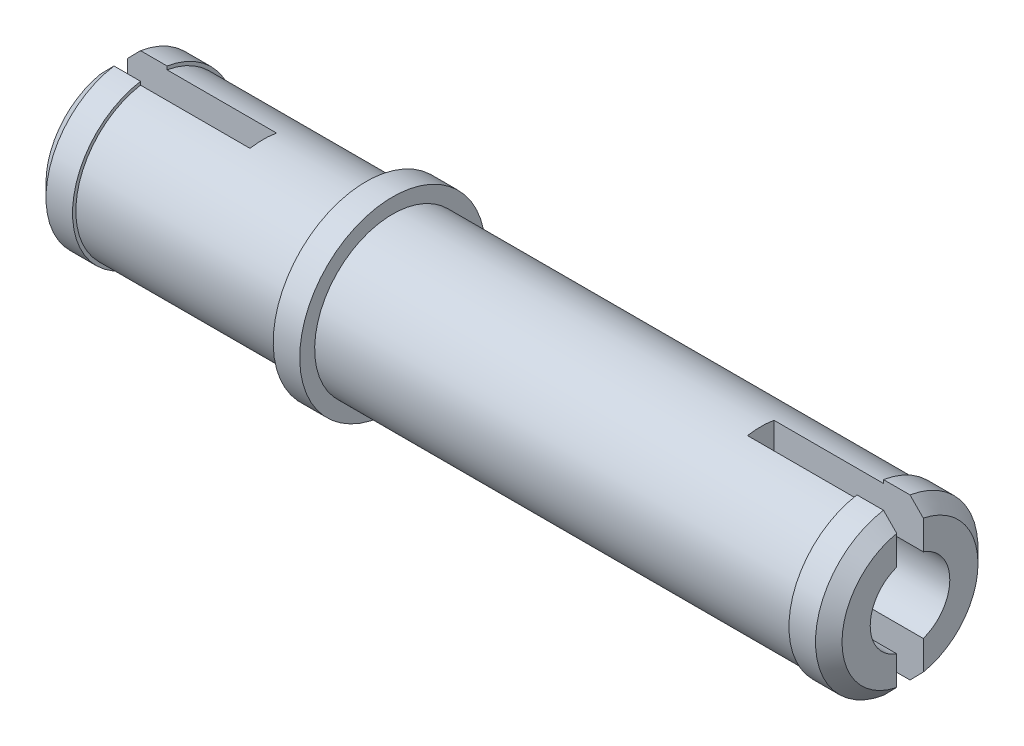
ISO-10303-21;
HEADER;
FILE_DESCRIPTION(('STEP AP214'),'2;1');
FILE_NAME('part.step','',(''),(''),'','','');
FILE_SCHEMA(('AUTOMOTIVE_DESIGN { 1 0 10303 214 1 1 1 1 }'));
ENDSEC;
DATA;
#1=APPLICATION_CONTEXT('core data for automotive mechanical design processes');
#2=APPLICATION_PROTOCOL_DEFINITION('international standard','automotive_design',2000,#1);
#3=PRODUCT_CONTEXT('',#1,'mechanical');
#4=PRODUCT('Part','Part','',(#3));
#5=PRODUCT_RELATED_PRODUCT_CATEGORY('part','',(#4));
#6=PRODUCT_DEFINITION_FORMATION('','',#4);
#7=PRODUCT_DEFINITION_CONTEXT('part definition',#1,'design');
#8=PRODUCT_DEFINITION('design','',#6,#7);
#9=PRODUCT_DEFINITION_SHAPE('','',#8);
#10=(LENGTH_UNIT() NAMED_UNIT(*) SI_UNIT(.MILLI.,.METRE.));
#11=(NAMED_UNIT(*) PLANE_ANGLE_UNIT() SI_UNIT($,.RADIAN.));
#12=(NAMED_UNIT(*) SI_UNIT($,.STERADIAN.) SOLID_ANGLE_UNIT());
#13=UNCERTAINTY_MEASURE_WITH_UNIT(LENGTH_MEASURE(1.E-05),#10,'distance_accuracy_value','');
#14=(GEOMETRIC_REPRESENTATION_CONTEXT(3) GLOBAL_UNCERTAINTY_ASSIGNED_CONTEXT((#13)) GLOBAL_UNIT_ASSIGNED_CONTEXT((#10,
#11,#12)) REPRESENTATION_CONTEXT('',''));
#15=CARTESIAN_POINT('',(0.,0.,0.));
#16=DIRECTION('',(0.,0.,1.));
#17=DIRECTION('',(1.,0.,0.));
#18=AXIS2_PLACEMENT_3D('',#15,#16,#17);
#19=CARTESIAN_POINT('',(-7.5,-2.8,-0.4));
#20=DIRECTION('',(1.,0.,0.));
#21=DIRECTION('',(0.,0.,-1.));
#22=AXIS2_PLACEMENT_3D('',#19,#20,#21);
#23=PLANE('',#22);
#24=DIRECTION('',(0.,1.,0.));
#25=VECTOR('',#24,1.);
#26=CARTESIAN_POINT('',(-7.5,-2.8,-0.4));
#27=LINE('',#26,#25);
#28=CARTESIAN_POINT('',(-7.5,1.13137084989848,-0.4));
#29=VERTEX_POINT('',#28);
#30=CARTESIAN_POINT('',(-7.5,2.31570723538188,-0.4));
#31=VERTEX_POINT('',#30);
#32=EDGE_CURVE('E361',#29,#31,#27,.T.);
#33=ORIENTED_EDGE('',*,*,#32,.F.);
#34=CARTESIAN_POINT('',(-7.5,0.,0.));
#35=DIRECTION('',(1.,0.,0.));
#36=DIRECTION('',(0.,0.,-1.));
#37=AXIS2_PLACEMENT_3D('',#34,#35,#36);
#38=CIRCLE('',#37,1.2);
#39=CARTESIAN_POINT('',(-7.5,1.13137084989848,0.4));
#40=VERTEX_POINT('',#39);
#41=EDGE_CURVE('E231',#29,#40,#38,.T.);
#42=ORIENTED_EDGE('',*,*,#41,.T.);
#43=DIRECTION('',(0.,1.,0.));
#44=VECTOR('',#43,1.);
#45=CARTESIAN_POINT('',(-7.5,-2.8,0.4));
#46=LINE('',#45,#44);
#47=CARTESIAN_POINT('',(-7.5,2.31570723538188,0.4));
#48=VERTEX_POINT('',#47);
#49=EDGE_CURVE('E488',#40,#48,#46,.T.);
#50=ORIENTED_EDGE('',*,*,#49,.T.);
#51=CARTESIAN_POINT('',(-7.5,0.,0.));
#52=DIRECTION('',(1.,0.,0.));
#53=DIRECTION('',(0.,0.,-1.));
#54=AXIS2_PLACEMENT_3D('',#51,#52,#53);
#55=CIRCLE('',#54,2.35);
#56=EDGE_CURVE('E263',#31,#48,#55,.T.);
#57=ORIENTED_EDGE('',*,*,#56,.F.);
#58=EDGE_LOOP('',(#33,#42,#50,#57));
#59=FACE_BOUND('',#58,.T.);
#60=ADVANCED_FACE('F43',(#59),#23,.F.);
#61=CARTESIAN_POINT('',(-14.822757876136,-2.8,0.4));
#62=DIRECTION('',(0.,0.,1.));
#63=DIRECTION('',(1.,0.,0.));
#64=AXIS2_PLACEMENT_3D('',#61,#62,#63);
#65=PLANE('',#64);
#66=DIRECTION('',(0.,-1.,0.));
#67=VECTOR('',#66,1.);
#68=CARTESIAN_POINT('',(-12.,0.,0.4));
#69=LINE('',#68,#67);
#70=CARTESIAN_POINT('',(-12.,-1.13137084989847,0.4));
#71=VERTEX_POINT('',#70);
#72=CARTESIAN_POINT('',(-12.,-2.01059692628831,0.4));
#73=VERTEX_POINT('',#72);
#74=EDGE_CURVE('E254',#71,#73,#69,.T.);
#75=ORIENTED_EDGE('',*,*,#74,.F.);
#76=DIRECTION('',(1.,0.,0.));
#77=VECTOR('',#76,1.);
#78=CARTESIAN_POINT('',(-12.,-1.13137084989847,0.4));
#79=LINE('',#78,#77);
#80=CARTESIAN_POINT('',(-7.5,-1.13137084989847,0.4));
#81=VERTEX_POINT('',#80);
#82=EDGE_CURVE('E235',#71,#81,#79,.T.);
#83=ORIENTED_EDGE('',*,*,#82,.T.);
#84=CARTESIAN_POINT('',(-7.5,-2.31570723538188,0.4));
#85=VERTEX_POINT('',#84);
#86=EDGE_CURVE('E372',#85,#81,#46,.T.);
#87=ORIENTED_EDGE('',*,*,#86,.F.);
#88=DIRECTION('',(-1.,0.,0.));
#89=VECTOR('',#88,1.);
#90=CARTESIAN_POINT('',(-12.,-2.31570723538188,0.4));
#91=LINE('',#90,#89);
#92=CARTESIAN_POINT('',(-10.8,-2.31570723538188,0.4));
#93=VERTEX_POINT('',#92);
#94=EDGE_CURVE('E394',#93,#85,#91,.F.);
#95=ORIENTED_EDGE('',*,*,#94,.F.);
#96=DIRECTION('',(0.,1.,0.));
#97=VECTOR('',#96,1.);
#98=CARTESIAN_POINT('',(-10.8,2.45,0.4));
#99=LINE('',#98,#97);
#100=CARTESIAN_POINT('',(-10.8,-2.41712639305437,0.4));
#101=VERTEX_POINT('',#100);
#102=EDGE_CURVE('E393',#101,#93,#99,.T.);
#103=ORIENTED_EDGE('',*,*,#102,.F.);
#104=DIRECTION('',(-1.,0.,0.));
#105=VECTOR('',#104,1.);
#106=CARTESIAN_POINT('',(-12.,-2.41712639305437,0.4));
#107=LINE('',#106,#105);
#108=CARTESIAN_POINT('',(-11.6,-2.41712639305437,0.4));
#109=VERTEX_POINT('',#108);
#110=EDGE_CURVE('E385',#109,#101,#107,.F.);
#111=ORIENTED_EDGE('',*,*,#110,.F.);
#112=CARTESIAN_POINT('',(-11.6,-2.41712639305437,0.4));
#113=CARTESIAN_POINT('',(-11.6667657648852,-2.34946899482109,0.4));
#114=CARTESIAN_POINT('',(-11.7334819790785,-2.2817628417537,0.4));
#115=CARTESIAN_POINT('',(-11.8668153124213,-2.14625301950762,0.4));
#116=CARTESIAN_POINT('',(-11.9334324315613,-2.07844935031966,0.4));
#117=CARTESIAN_POINT('',(-12.,-2.01059692628831,0.4));
#118=B_SPLINE_CURVE_WITH_KNOTS('',3,(#112,#113,#114,#115,#116,#117),.UNSPECIFIED.,.F.,.F.,(4,2,
4),(0.,0.28516063472249,0.570321296561957),.UNSPECIFIED.);
#119=EDGE_CURVE('E563',#109,#73,#118,.T.);
#120=ORIENTED_EDGE('',*,*,#119,.T.);
#121=EDGE_LOOP('',(#75,#83,#87,#95,#103,#111,#120));
#122=FACE_BOUND('',#121,.T.);
#123=ADVANCED_FACE('F485',(#122),#65,.F.);
#124=CARTESIAN_POINT('',(-14.822757876136,-2.8,-0.4));
#125=DIRECTION('',(0.,0.,-1.));
#126=DIRECTION('',(-1.,0.,0.));
#127=AXIS2_PLACEMENT_3D('',#124,#125,#126);
#128=PLANE('',#127);
#129=DIRECTION('',(0.,1.,0.));
#130=VECTOR('',#129,1.);
#131=CARTESIAN_POINT('',(-12.,0.,-0.4));
#132=LINE('',#131,#130);
#133=CARTESIAN_POINT('',(-12.,1.13137084989848,-0.4));
#134=VERTEX_POINT('',#133);
#135=CARTESIAN_POINT('',(-12.,2.0105969262883,-0.4));
#136=VERTEX_POINT('',#135);
#137=EDGE_CURVE('E241',#134,#136,#132,.T.);
#138=ORIENTED_EDGE('',*,*,#137,.F.);
#139=DIRECTION('',(1.,0.,0.));
#140=VECTOR('',#139,1.);
#141=CARTESIAN_POINT('',(-12.,1.13137084989848,-0.4));
#142=LINE('',#141,#140);
#143=EDGE_CURVE('E228',#134,#29,#142,.T.);
#144=ORIENTED_EDGE('',*,*,#143,.T.);
#145=ORIENTED_EDGE('',*,*,#32,.T.);
#146=DIRECTION('',(-1.,0.,0.));
#147=VECTOR('',#146,1.);
#148=CARTESIAN_POINT('',(-12.,2.31570723538188,-0.4));
#149=LINE('',#148,#147);
#150=CARTESIAN_POINT('',(-10.8,2.31570723538188,-0.4));
#151=VERTEX_POINT('',#150);
#152=EDGE_CURVE('E379',#151,#31,#149,.F.);
#153=ORIENTED_EDGE('',*,*,#152,.F.);
#154=DIRECTION('',(0.,-1.,0.));
#155=VECTOR('',#154,1.);
#156=CARTESIAN_POINT('',(-10.8,2.45,-0.4));
#157=LINE('',#156,#155);
#158=CARTESIAN_POINT('',(-10.8,2.41712639305436,-0.4));
#159=VERTEX_POINT('',#158);
#160=EDGE_CURVE('E378',#159,#151,#157,.T.);
#161=ORIENTED_EDGE('',*,*,#160,.F.);
#162=DIRECTION('',(-1.,0.,0.));
#163=VECTOR('',#162,1.);
#164=CARTESIAN_POINT('',(-12.,2.41712639305436,-0.4));
#165=LINE('',#164,#163);
#166=CARTESIAN_POINT('',(-11.6,2.41712639305436,-0.4));
#167=VERTEX_POINT('',#166);
#168=EDGE_CURVE('E369',#167,#159,#165,.F.);
#169=ORIENTED_EDGE('',*,*,#168,.F.);
#170=CARTESIAN_POINT('',(-11.6,2.41712639305436,-0.4));
#171=CARTESIAN_POINT('',(-11.6667657648852,2.34946899482109,-0.4));
#172=CARTESIAN_POINT('',(-11.7334819790785,2.2817628417537,-0.4));
#173=CARTESIAN_POINT('',(-11.8668153124213,2.14625301950761,-0.4));
#174=CARTESIAN_POINT('',(-11.9334324315613,2.07844935031965,-0.4));
#175=CARTESIAN_POINT('',(-12.,2.0105969262883,-0.4));
#176=B_SPLINE_CURVE_WITH_KNOTS('',3,(#170,#171,#172,#173,#174,#175),.UNSPECIFIED.,.F.,.F.,(4,2,
4),(0.,0.285160634722489,0.570321296561957),.UNSPECIFIED.);
#177=EDGE_CURVE('E250',#167,#136,#176,.T.);
#178=ORIENTED_EDGE('',*,*,#177,.T.);
#179=EDGE_LOOP('',(#138,#144,#145,#153,#161,#169,#178));
#180=FACE_BOUND('',#179,.T.);
#181=ADVANCED_FACE('F247',(#180),#128,.F.);
#182=CARTESIAN_POINT('',(7.5,-2.8,-0.400000000000001));
#183=DIRECTION('',(-1.,0.,0.));
#184=DIRECTION('',(0.,0.,1.));
#185=AXIS2_PLACEMENT_3D('',#182,#183,#184);
#186=PLANE('',#185);
#187=DIRECTION('',(0.,1.,0.));
#188=VECTOR('',#187,1.);
#189=CARTESIAN_POINT('',(7.5,-2.8,0.399999999999999));
#190=LINE('',#189,#188);
#191=CARTESIAN_POINT('',(7.5,1.13137084989848,0.399999999999999));
#192=VERTEX_POINT('',#191);
#193=CARTESIAN_POINT('',(7.5,2.31570723538188,0.399999999999999));
#194=VERTEX_POINT('',#193);
#195=EDGE_CURVE('E350',#192,#194,#190,.T.);
#196=ORIENTED_EDGE('',*,*,#195,.F.);
#197=CARTESIAN_POINT('',(7.5,0.,0.));
#198=DIRECTION('',(-1.,0.,0.));
#199=DIRECTION('',(0.,0.,1.));
#200=AXIS2_PLACEMENT_3D('',#197,#198,#199);
#201=CIRCLE('',#200,1.2);
#202=CARTESIAN_POINT('',(7.5,1.13137084989848,-0.400000000000001));
#203=VERTEX_POINT('',#202);
#204=EDGE_CURVE('E68',#192,#203,#201,.T.);
#205=ORIENTED_EDGE('',*,*,#204,.T.);
#206=DIRECTION('',(0.,1.,0.));
#207=VECTOR('',#206,1.);
#208=CARTESIAN_POINT('',(7.5,-2.8,-0.400000000000001));
#209=LINE('',#208,#207);
#210=CARTESIAN_POINT('',(7.5,2.31570723538188,-0.400000000000001));
#211=VERTEX_POINT('',#210);
#212=EDGE_CURVE('E363',#203,#211,#209,.T.);
#213=ORIENTED_EDGE('',*,*,#212,.T.);
#214=CARTESIAN_POINT('',(7.5,0.,0.));
#215=DIRECTION('',(-1.,0.,0.));
#216=DIRECTION('',(0.,0.,1.));
#217=AXIS2_PLACEMENT_3D('',#214,#215,#216);
#218=CIRCLE('',#217,2.35);
#219=EDGE_CURVE('E274',#194,#211,#218,.T.);
#220=ORIENTED_EDGE('',*,*,#219,.F.);
#221=EDGE_LOOP('',(#196,#205,#213,#220));
#222=FACE_BOUND('',#221,.T.);
#223=ADVANCED_FACE('F322',(#222),#186,.F.);
#224=CARTESIAN_POINT('',(14.0570065467415,-2.8,-0.400000000000001));
#225=DIRECTION('',(0.,0.,-1.));
#226=DIRECTION('',(-1.,0.,0.));
#227=AXIS2_PLACEMENT_3D('',#224,#225,#226);
#228=PLANE('',#227);
#229=ORIENTED_EDGE('',*,*,#212,.F.);
#230=DIRECTION('',(1.,0.,0.));
#231=VECTOR('',#230,1.);
#232=CARTESIAN_POINT('',(-12.,1.13137084989848,-0.4));
#233=LINE('',#232,#231);
#234=CARTESIAN_POINT('',(12.,1.13137084989848,-0.4));
#235=VERTEX_POINT('',#234);
#236=EDGE_CURVE('E505',#203,#235,#233,.T.);
#237=ORIENTED_EDGE('',*,*,#236,.T.);
#238=DIRECTION('',(0.,-1.,0.));
#239=VECTOR('',#238,1.);
#240=CARTESIAN_POINT('',(12.,2.45,-0.400000000000001));
#241=LINE('',#240,#239);
#242=CARTESIAN_POINT('',(12.,2.01059692628831,-0.400000000000001));
#243=VERTEX_POINT('',#242);
#244=EDGE_CURVE('E420',#243,#235,#241,.T.);
#245=ORIENTED_EDGE('',*,*,#244,.F.);
#246=CARTESIAN_POINT('',(12.,2.01059692628831,-0.400000000000001));
#247=CARTESIAN_POINT('',(11.9334324315613,2.07844935031966,-0.400000000000001));
#248=CARTESIAN_POINT('',(11.8668153124213,2.14625301950762,-0.400000000000001));
#249=CARTESIAN_POINT('',(11.7334819790785,2.2817628417537,-0.400000000000001));
#250=CARTESIAN_POINT('',(11.6667657648852,2.34946899482109,-0.400000000000001));
#251=CARTESIAN_POINT('',(11.6,2.41712639305436,-0.400000000000001));
#252=B_SPLINE_CURVE_WITH_KNOTS('',3,(#246,#247,#248,#249,#250,#251),.UNSPECIFIED.,.F.,.F.,(4,2,
4),(0.,0.285160661839461,0.570321296561944),.UNSPECIFIED.);
#253=CARTESIAN_POINT('',(11.6,2.41712639305436,-0.4));
#254=VERTEX_POINT('',#253);
#255=EDGE_CURVE('E540',#243,#254,#252,.T.);
#256=ORIENTED_EDGE('',*,*,#255,.T.);
#257=DIRECTION('',(-1.,0.,0.));
#258=VECTOR('',#257,1.);
#259=CARTESIAN_POINT('',(-12.,2.41712639305436,-0.4));
#260=LINE('',#259,#258);
#261=CARTESIAN_POINT('',(10.8,2.41712639305436,-0.400000000000001));
#262=VERTEX_POINT('',#261);
#263=EDGE_CURVE('E415',#262,#254,#260,.F.);
#264=ORIENTED_EDGE('',*,*,#263,.F.);
#265=DIRECTION('',(0.,1.,0.));
#266=VECTOR('',#265,1.);
#267=CARTESIAN_POINT('',(10.8,2.35,-0.400000000000001));
#268=LINE('',#267,#266);
#269=CARTESIAN_POINT('',(10.8,2.31570723538188,-0.4));
#270=VERTEX_POINT('',#269);
#271=EDGE_CURVE('E412',#270,#262,#268,.T.);
#272=ORIENTED_EDGE('',*,*,#271,.F.);
#273=DIRECTION('',(-1.,0.,0.));
#274=VECTOR('',#273,1.);
#275=CARTESIAN_POINT('',(-12.,2.31570723538188,-0.4));
#276=LINE('',#275,#274);
#277=EDGE_CURVE('E280',#211,#270,#276,.F.);
#278=ORIENTED_EDGE('',*,*,#277,.F.);
#279=EDGE_LOOP('',(#229,#237,#245,#256,#264,#272,#278));
#280=FACE_BOUND('',#279,.T.);
#281=ADVANCED_FACE('F584',(#280),#228,.F.);
#282=CARTESIAN_POINT('',(14.0570065467415,-2.8,0.399999999999999));
#283=DIRECTION('',(0.,0.,1.));
#284=DIRECTION('',(1.,0.,0.));
#285=AXIS2_PLACEMENT_3D('',#282,#283,#284);
#286=PLANE('',#285);
#287=CARTESIAN_POINT('',(7.5,-2.31570723538188,0.399999999999999));
#288=VERTEX_POINT('',#287);
#289=CARTESIAN_POINT('',(7.5,-1.13137084989847,0.4));
#290=VERTEX_POINT('',#289);
#291=EDGE_CURVE('E357',#288,#290,#190,.T.);
#292=ORIENTED_EDGE('',*,*,#291,.T.);
#293=DIRECTION('',(1.,0.,0.));
#294=VECTOR('',#293,1.);
#295=CARTESIAN_POINT('',(-12.,-1.13137084989847,0.4));
#296=LINE('',#295,#294);
#297=CARTESIAN_POINT('',(12.,-1.13137084989847,0.399999999999999));
#298=VERTEX_POINT('',#297);
#299=EDGE_CURVE('E11',#290,#298,#296,.T.);
#300=ORIENTED_EDGE('',*,*,#299,.T.);
#301=DIRECTION('',(0.,1.,0.));
#302=VECTOR('',#301,1.);
#303=CARTESIAN_POINT('',(12.,2.45,0.399999999999999));
#304=LINE('',#303,#302);
#305=CARTESIAN_POINT('',(12.,-2.01059692628831,0.399999999999999));
#306=VERTEX_POINT('',#305);
#307=EDGE_CURVE('E407',#306,#298,#304,.T.);
#308=ORIENTED_EDGE('',*,*,#307,.F.);
#309=CARTESIAN_POINT('',(12.,-2.01059692628831,0.399999999999999));
#310=CARTESIAN_POINT('',(11.9334324315613,-2.07844935031966,0.399999999999999));
#311=CARTESIAN_POINT('',(11.8668153124213,-2.14625301950762,0.399999999999999));
#312=CARTESIAN_POINT('',(11.7334819790785,-2.2817628417537,0.399999999999999));
#313=CARTESIAN_POINT('',(11.6667657648852,-2.34946899482109,0.399999999999999));
#314=CARTESIAN_POINT('',(11.6,-2.41712639305436,0.399999999999999));
#315=B_SPLINE_CURVE_WITH_KNOTS('',3,(#309,#310,#311,#312,#313,#314),.UNSPECIFIED.,.F.,.F.,(4,2,
4),(0.,0.285160661839461,0.570321296561942),.UNSPECIFIED.);
#316=CARTESIAN_POINT('',(11.6,-2.41712639305436,0.4));
#317=VERTEX_POINT('',#316);
#318=EDGE_CURVE('E333',#306,#317,#315,.T.);
#319=ORIENTED_EDGE('',*,*,#318,.T.);
#320=DIRECTION('',(-1.,0.,0.));
#321=VECTOR('',#320,1.);
#322=CARTESIAN_POINT('',(-12.,-2.41712639305437,0.4));
#323=LINE('',#322,#321);
#324=CARTESIAN_POINT('',(10.8,-2.41712639305436,0.399999999999999));
#325=VERTEX_POINT('',#324);
#326=EDGE_CURVE('E403',#325,#317,#323,.F.);
#327=ORIENTED_EDGE('',*,*,#326,.F.);
#328=DIRECTION('',(0.,-1.,0.));
#329=VECTOR('',#328,1.);
#330=CARTESIAN_POINT('',(10.8,2.35,0.399999999999999));
#331=LINE('',#330,#329);
#332=CARTESIAN_POINT('',(10.8,-2.31570723538188,0.4));
#333=VERTEX_POINT('',#332);
#334=EDGE_CURVE('E400',#333,#325,#331,.T.);
#335=ORIENTED_EDGE('',*,*,#334,.F.);
#336=DIRECTION('',(-1.,0.,0.));
#337=VECTOR('',#336,1.);
#338=CARTESIAN_POINT('',(-12.,-2.31570723538188,0.4));
#339=LINE('',#338,#337);
#340=EDGE_CURVE('E267',#288,#333,#339,.F.);
#341=ORIENTED_EDGE('',*,*,#340,.F.);
#342=EDGE_LOOP('',(#292,#300,#308,#319,#327,#335,#341));
#343=FACE_BOUND('',#342,.T.);
#344=ADVANCED_FACE('F328',(#343),#286,.F.);
#345=CARTESIAN_POINT('',(12.,2.45,0.));
#346=DIRECTION('',(-1.,0.,0.));
#347=DIRECTION('',(0.,-1.,0.));
#348=AXIS2_PLACEMENT_3D('',#345,#346,#347);
#349=PLANE('',#348);
#350=ORIENTED_EDGE('',*,*,#244,.T.);
#351=CARTESIAN_POINT('',(12.,0.,0.));
#352=DIRECTION('',(-1.,0.,0.));
#353=DIRECTION('',(0.,-1.,0.));
#354=AXIS2_PLACEMENT_3D('',#351,#352,#353);
#355=CIRCLE('',#354,1.2);
#356=CARTESIAN_POINT('',(12.,-1.13137084989847,-0.400000000000001));
#357=VERTEX_POINT('',#356);
#358=EDGE_CURVE('E501',#235,#357,#355,.T.);
#359=ORIENTED_EDGE('',*,*,#358,.T.);
#360=CARTESIAN_POINT('',(12.,-2.01059692628831,-0.400000000000001));
#361=VERTEX_POINT('',#360);
#362=EDGE_CURVE('E419',#357,#361,#241,.T.);
#363=ORIENTED_EDGE('',*,*,#362,.T.);
#364=CARTESIAN_POINT('',(12.,0.,0.));
#365=DIRECTION('',(-1.,0.,0.));
#366=DIRECTION('',(0.,-1.,0.));
#367=AXIS2_PLACEMENT_3D('',#364,#365,#366);
#368=CIRCLE('',#367,2.05);
#369=EDGE_CURVE('E530',#361,#243,#368,.F.);
#370=ORIENTED_EDGE('',*,*,#369,.T.);
#371=EDGE_LOOP('',(#350,#359,#363,#370));
#372=FACE_BOUND('',#371,.T.);
#373=ADVANCED_FACE('F589',(#372),#349,.F.);
#374=CARTESIAN_POINT('',(-12.,0.,0.));
#375=DIRECTION('',(-1.,0.,0.));
#376=DIRECTION('',(0.,-1.,0.));
#377=AXIS2_PLACEMENT_3D('',#374,#375,#376);
#378=CYLINDRICAL_SURFACE('',#377,2.45);
#379=ORIENTED_EDGE('',*,*,#263,.T.);
#380=CARTESIAN_POINT('',(11.6,0.,0.));
#381=DIRECTION('',(-1.,0.,0.));
#382=DIRECTION('',(0.,-1.,0.));
#383=AXIS2_PLACEMENT_3D('',#380,#381,#382);
#384=CIRCLE('',#383,2.45);
#385=CARTESIAN_POINT('',(11.6,-2.41712639305436,-0.4));
#386=VERTEX_POINT('',#385);
#387=EDGE_CURVE('E577',#254,#386,#384,.T.);
#388=ORIENTED_EDGE('',*,*,#387,.T.);
#389=DIRECTION('',(-1.,0.,0.));
#390=VECTOR('',#389,1.);
#391=CARTESIAN_POINT('',(-12.,-2.41712639305437,-0.4));
#392=LINE('',#391,#390);
#393=CARTESIAN_POINT('',(10.8,-2.41712639305436,-0.4));
#394=VERTEX_POINT('',#393);
#395=EDGE_CURVE('E423',#386,#394,#392,.T.);
#396=ORIENTED_EDGE('',*,*,#395,.T.);
#397=CARTESIAN_POINT('',(10.8,0.,0.));
#398=DIRECTION('',(-1.,0.,0.));
#399=DIRECTION('',(0.,-1.,0.));
#400=AXIS2_PLACEMENT_3D('',#397,#398,#399);
#401=CIRCLE('',#400,2.45);
#402=EDGE_CURVE('E256',#262,#394,#401,.T.);
#403=ORIENTED_EDGE('',*,*,#402,.F.);
#404=EDGE_LOOP('',(#379,#388,#396,#403));
#405=FACE_BOUND('',#404,.T.);
#406=ADVANCED_FACE('F586',(#405),#378,.T.);
#407=CARTESIAN_POINT('',(10.8,2.35,0.));
#408=DIRECTION('',(1.,0.,0.));
#409=DIRECTION('',(0.,1.,0.));
#410=AXIS2_PLACEMENT_3D('',#407,#408,#409);
#411=PLANE('',#410);
#412=ORIENTED_EDGE('',*,*,#402,.T.);
#413=CARTESIAN_POINT('',(10.8,-2.31570723538188,-0.400000000000001));
#414=VERTEX_POINT('',#413);
#415=EDGE_CURVE('E416',#394,#414,#268,.T.);
#416=ORIENTED_EDGE('',*,*,#415,.T.);
#417=CARTESIAN_POINT('',(10.8,0.,0.));
#418=DIRECTION('',(-1.,0.,0.));
#419=DIRECTION('',(0.,-1.,0.));
#420=AXIS2_PLACEMENT_3D('',#417,#418,#419);
#421=CIRCLE('',#420,2.35);
#422=EDGE_CURVE('E444',#270,#414,#421,.T.);
#423=ORIENTED_EDGE('',*,*,#422,.F.);
#424=ORIENTED_EDGE('',*,*,#271,.T.);
#425=EDGE_LOOP('',(#412,#416,#423,#424));
#426=FACE_BOUND('',#425,.T.);
#427=ADVANCED_FACE('F456',(#426),#411,.F.);
#428=CARTESIAN_POINT('',(-10.8,2.45,0.));
#429=DIRECTION('',(-1.,0.,0.));
#430=DIRECTION('',(0.,-1.,0.));
#431=AXIS2_PLACEMENT_3D('',#428,#429,#430);
#432=PLANE('',#431);
#433=CARTESIAN_POINT('',(-10.8,0.,0.));
#434=DIRECTION('',(-1.,0.,0.));
#435=DIRECTION('',(0.,-1.,0.));
#436=AXIS2_PLACEMENT_3D('',#433,#434,#435);
#437=CIRCLE('',#436,2.45);
#438=CARTESIAN_POINT('',(-10.8,2.41712639305436,0.4));
#439=VERTEX_POINT('',#438);
#440=EDGE_CURVE('E425',#101,#439,#437,.T.);
#441=ORIENTED_EDGE('',*,*,#440,.F.);
#442=ORIENTED_EDGE('',*,*,#102,.T.);
#443=CARTESIAN_POINT('',(-10.8,0.,0.));
#444=DIRECTION('',(-1.,0.,0.));
#445=DIRECTION('',(0.,-1.,0.));
#446=AXIS2_PLACEMENT_3D('',#443,#444,#445);
#447=CIRCLE('',#446,2.35);
#448=CARTESIAN_POINT('',(-10.8,2.31570723538188,0.4));
#449=VERTEX_POINT('',#448);
#450=EDGE_CURVE('E430',#93,#449,#447,.T.);
#451=ORIENTED_EDGE('',*,*,#450,.T.);
#452=EDGE_CURVE('E390',#449,#439,#99,.T.);
#453=ORIENTED_EDGE('',*,*,#452,.T.);
#454=EDGE_LOOP('',(#441,#442,#451,#453));
#455=FACE_BOUND('',#454,.T.);
#456=ADVANCED_FACE('F754',(#455),#432,.F.);
#457=CARTESIAN_POINT('',(-12.,0.,0.));
#458=DIRECTION('',(-1.,0.,0.));
#459=DIRECTION('',(0.,-1.,0.));
#460=AXIS2_PLACEMENT_3D('',#457,#458,#459);
#461=CYLINDRICAL_SURFACE('',#460,2.45);
#462=DIRECTION('',(-1.,0.,0.));
#463=VECTOR('',#462,1.);
#464=CARTESIAN_POINT('',(-12.,2.41712639305436,0.4));
#465=LINE('',#464,#463);
#466=CARTESIAN_POINT('',(-11.6,2.41712639305436,0.4));
#467=VERTEX_POINT('',#466);
#468=EDGE_CURVE('E387',#439,#467,#465,.T.);
#469=ORIENTED_EDGE('',*,*,#468,.T.);
#470=CARTESIAN_POINT('',(-11.6,0.,0.));
#471=DIRECTION('',(1.,0.,0.));
#472=DIRECTION('',(0.,1.,0.));
#473=AXIS2_PLACEMENT_3D('',#470,#471,#472);
#474=CIRCLE('',#473,2.45);
#475=EDGE_CURVE('E576',#467,#109,#474,.T.);
#476=ORIENTED_EDGE('',*,*,#475,.T.);
#477=ORIENTED_EDGE('',*,*,#110,.T.);
#478=ORIENTED_EDGE('',*,*,#440,.T.);
#479=EDGE_LOOP('',(#469,#476,#477,#478));
#480=FACE_BOUND('',#479,.T.);
#481=ADVANCED_FACE('F694',(#480),#461,.T.);
#482=CARTESIAN_POINT('',(-12.,0.,0.));
#483=DIRECTION('',(1.,0.,0.));
#484=DIRECTION('',(0.,1.,0.));
#485=AXIS2_PLACEMENT_3D('',#482,#483,#484);
#486=PLANE('',#485);
#487=CARTESIAN_POINT('',(-12.,2.0105969262883,0.4));
#488=VERTEX_POINT('',#487);
#489=CARTESIAN_POINT('',(-12.,1.13137084989848,0.4));
#490=VERTEX_POINT('',#489);
#491=EDGE_CURVE('E260',#488,#490,#69,.T.);
#492=ORIENTED_EDGE('',*,*,#491,.T.);
#493=CARTESIAN_POINT('',(-12.,0.,0.));
#494=DIRECTION('',(1.,0.,0.));
#495=DIRECTION('',(0.,0.,-1.));
#496=AXIS2_PLACEMENT_3D('',#493,#494,#495);
#497=CIRCLE('',#496,1.2);
#498=EDGE_CURVE('E245',#490,#71,#497,.T.);
#499=ORIENTED_EDGE('',*,*,#498,.T.);
#500=ORIENTED_EDGE('',*,*,#74,.T.);
#501=CARTESIAN_POINT('',(-12.,0.,0.));
#502=DIRECTION('',(1.,0.,0.));
#503=DIRECTION('',(0.,1.,0.));
#504=AXIS2_PLACEMENT_3D('',#501,#502,#503);
#505=CIRCLE('',#504,2.04999999999999);
#506=EDGE_CURVE('E610',#73,#488,#505,.F.);
#507=ORIENTED_EDGE('',*,*,#506,.T.);
#508=EDGE_LOOP('',(#492,#499,#500,#507));
#509=FACE_BOUND('',#508,.T.);
#510=ADVANCED_FACE('F602',(#509),#486,.F.);
#511=ORIENTED_EDGE('',*,*,#307,.T.);
#512=CARTESIAN_POINT('',(12.,0.,0.));
#513=DIRECTION('',(-1.,0.,0.));
#514=DIRECTION('',(0.,-1.,0.));
#515=AXIS2_PLACEMENT_3D('',#512,#513,#514);
#516=CIRCLE('',#515,1.2);
#517=CARTESIAN_POINT('',(12.,1.13137084989848,0.4));
#518=VERTEX_POINT('',#517);
#519=EDGE_CURVE('E508',#298,#518,#516,.T.);
#520=ORIENTED_EDGE('',*,*,#519,.T.);
#521=CARTESIAN_POINT('',(12.,2.01059692628832,0.399999999999999));
#522=VERTEX_POINT('',#521);
#523=EDGE_CURVE('E352',#518,#522,#304,.T.);
#524=ORIENTED_EDGE('',*,*,#523,.T.);
#525=CARTESIAN_POINT('',(12.,0.,0.));
#526=DIRECTION('',(-1.,0.,0.));
#527=DIRECTION('',(0.,-1.,0.));
#528=AXIS2_PLACEMENT_3D('',#525,#526,#527);
#529=CIRCLE('',#528,2.05);
#530=EDGE_CURVE('E347',#522,#306,#529,.F.);
#531=ORIENTED_EDGE('',*,*,#530,.T.);
#532=EDGE_LOOP('',(#511,#520,#524,#531));
#533=FACE_BOUND('',#532,.T.);
#534=ADVANCED_FACE('F686',(#533),#349,.F.);
#535=ORIENTED_EDGE('',*,*,#326,.T.);
#536=CARTESIAN_POINT('',(11.6,0.,0.));
#537=DIRECTION('',(-1.,0.,0.));
#538=DIRECTION('',(0.,-1.,0.));
#539=AXIS2_PLACEMENT_3D('',#536,#537,#538);
#540=CIRCLE('',#539,2.45);
#541=CARTESIAN_POINT('',(11.6,2.41712639305436,0.4));
#542=VERTEX_POINT('',#541);
#543=EDGE_CURVE('E527',#317,#542,#540,.T.);
#544=ORIENTED_EDGE('',*,*,#543,.T.);
#545=DIRECTION('',(-1.,0.,0.));
#546=VECTOR('',#545,1.);
#547=CARTESIAN_POINT('',(-12.,2.41712639305436,0.4));
#548=LINE('',#547,#546);
#549=CARTESIAN_POINT('',(10.8,2.41712639305436,0.4));
#550=VERTEX_POINT('',#549);
#551=EDGE_CURVE('E410',#542,#550,#548,.T.);
#552=ORIENTED_EDGE('',*,*,#551,.T.);
#553=EDGE_CURVE('E252',#325,#550,#401,.T.);
#554=ORIENTED_EDGE('',*,*,#553,.F.);
#555=EDGE_LOOP('',(#535,#544,#552,#554));
#556=FACE_BOUND('',#555,.T.);
#557=ADVANCED_FACE('F525',(#556),#378,.T.);
#558=ORIENTED_EDGE('',*,*,#553,.T.);
#559=CARTESIAN_POINT('',(10.8,2.31570723538188,0.399999999999999));
#560=VERTEX_POINT('',#559);
#561=EDGE_CURVE('E404',#550,#560,#331,.T.);
#562=ORIENTED_EDGE('',*,*,#561,.T.);
#563=EDGE_CURVE('E445',#333,#560,#421,.T.);
#564=ORIENTED_EDGE('',*,*,#563,.F.);
#565=ORIENTED_EDGE('',*,*,#334,.T.);
#566=EDGE_LOOP('',(#558,#562,#564,#565));
#567=FACE_BOUND('',#566,.T.);
#568=ADVANCED_FACE('F518',(#567),#411,.F.);
#569=CARTESIAN_POINT('',(-12.,0.,0.));
#570=DIRECTION('',(-1.,0.,0.));
#571=DIRECTION('',(0.,-1.,0.));
#572=AXIS2_PLACEMENT_3D('',#569,#570,#571);
#573=CYLINDRICAL_SURFACE('',#572,2.35);
#574=CARTESIAN_POINT('',(-3.6,0.,0.));
#575=DIRECTION('',(-1.,0.,0.));
#576=DIRECTION('',(0.,-1.,0.));
#577=AXIS2_PLACEMENT_3D('',#574,#575,#576);
#578=CIRCLE('',#577,2.35);
#579=CARTESIAN_POINT('',(-3.6,-2.35,0.));
#580=VERTEX_POINT('',#579);
#581=EDGE_CURVE('E442',#580,#580,#578,.T.);
#582=ORIENTED_EDGE('',*,*,#581,.F.);
#583=EDGE_LOOP('',(#582));
#584=FACE_BOUND('',#583,.T.);
#585=ORIENTED_EDGE('',*,*,#219,.T.);
#586=ORIENTED_EDGE('',*,*,#277,.T.);
#587=ORIENTED_EDGE('',*,*,#422,.T.);
#588=DIRECTION('',(-1.,0.,0.));
#589=VECTOR('',#588,1.);
#590=CARTESIAN_POINT('',(-12.,-2.31570723538188,-0.4));
#591=LINE('',#590,#589);
#592=CARTESIAN_POINT('',(7.5,-2.31570723538188,-0.400000000000001));
#593=VERTEX_POINT('',#592);
#594=EDGE_CURVE('E273',#414,#593,#591,.T.);
#595=ORIENTED_EDGE('',*,*,#594,.T.);
#596=EDGE_CURVE('E270',#593,#288,#218,.T.);
#597=ORIENTED_EDGE('',*,*,#596,.T.);
#598=ORIENTED_EDGE('',*,*,#340,.T.);
#599=ORIENTED_EDGE('',*,*,#563,.T.);
#600=DIRECTION('',(-1.,0.,0.));
#601=VECTOR('',#600,1.);
#602=CARTESIAN_POINT('',(-12.,2.31570723538188,0.4));
#603=LINE('',#602,#601);
#604=EDGE_CURVE('E277',#560,#194,#603,.T.);
#605=ORIENTED_EDGE('',*,*,#604,.T.);
#606=EDGE_LOOP('',(#585,#586,#587,#595,#597,#598,#599,#605));
#607=FACE_BOUND('',#606,.T.);
#608=ADVANCED_FACE('F452',(#584,#607),#573,.T.);
#609=CARTESIAN_POINT('',(-3.6,2.8,0.));
#610=DIRECTION('',(-1.,0.,0.));
#611=DIRECTION('',(0.,-1.,0.));
#612=AXIS2_PLACEMENT_3D('',#609,#610,#611);
#613=PLANE('',#612);
#614=CARTESIAN_POINT('',(-3.6,0.,0.));
#615=DIRECTION('',(-1.,0.,0.));
#616=DIRECTION('',(0.,-1.,0.));
#617=AXIS2_PLACEMENT_3D('',#614,#615,#616);
#618=CIRCLE('',#617,2.8);
#619=CARTESIAN_POINT('',(-3.6,-2.8,0.));
#620=VERTEX_POINT('',#619);
#621=EDGE_CURVE('E439',#620,#620,#618,.T.);
#622=ORIENTED_EDGE('',*,*,#621,.F.);
#623=EDGE_LOOP('',(#622));
#624=FACE_BOUND('',#623,.T.);
#625=ORIENTED_EDGE('',*,*,#581,.T.);
#626=EDGE_LOOP('',(#625));
#627=FACE_BOUND('',#626,.T.);
#628=ADVANCED_FACE('F775',(#624,#627),#613,.F.);
#629=CARTESIAN_POINT('',(-12.,0.,0.));
#630=DIRECTION('',(-1.,0.,0.));
#631=DIRECTION('',(0.,-1.,0.));
#632=AXIS2_PLACEMENT_3D('',#629,#630,#631);
#633=CYLINDRICAL_SURFACE('',#632,2.8);
#634=CARTESIAN_POINT('',(-4.4,0.,0.));
#635=DIRECTION('',(-1.,0.,0.));
#636=DIRECTION('',(0.,-1.,0.));
#637=AXIS2_PLACEMENT_3D('',#634,#635,#636);
#638=CIRCLE('',#637,2.8);
#639=CARTESIAN_POINT('',(-4.4,-2.8,0.));
#640=VERTEX_POINT('',#639);
#641=EDGE_CURVE('E436',#640,#640,#638,.T.);
#642=ORIENTED_EDGE('',*,*,#641,.F.);
#643=EDGE_LOOP('',(#642));
#644=FACE_BOUND('',#643,.T.);
#645=ORIENTED_EDGE('',*,*,#621,.T.);
#646=EDGE_LOOP('',(#645));
#647=FACE_BOUND('',#646,.T.);
#648=ADVANCED_FACE('F771',(#644,#647),#633,.T.);
#649=CARTESIAN_POINT('',(-4.4,2.35,0.));
#650=DIRECTION('',(1.,0.,0.));
#651=DIRECTION('',(0.,1.,0.));
#652=AXIS2_PLACEMENT_3D('',#649,#650,#651);
#653=PLANE('',#652);
#654=CARTESIAN_POINT('',(-4.4,0.,0.));
#655=DIRECTION('',(-1.,0.,0.));
#656=DIRECTION('',(0.,-1.,0.));
#657=AXIS2_PLACEMENT_3D('',#654,#655,#656);
#658=CIRCLE('',#657,2.35);
#659=CARTESIAN_POINT('',(-4.4,-2.35,0.));
#660=VERTEX_POINT('',#659);
#661=EDGE_CURVE('E433',#660,#660,#658,.T.);
#662=ORIENTED_EDGE('',*,*,#661,.F.);
#663=EDGE_LOOP('',(#662));
#664=FACE_BOUND('',#663,.T.);
#665=ORIENTED_EDGE('',*,*,#641,.T.);
#666=EDGE_LOOP('',(#665));
#667=FACE_BOUND('',#666,.T.);
#668=ADVANCED_FACE('F766',(#664,#667),#653,.F.);
#669=CARTESIAN_POINT('',(-12.,0.,0.));
#670=DIRECTION('',(-1.,0.,0.));
#671=DIRECTION('',(0.,-1.,0.));
#672=AXIS2_PLACEMENT_3D('',#669,#670,#671);
#673=CYLINDRICAL_SURFACE('',#672,2.35);
#674=ORIENTED_EDGE('',*,*,#450,.F.);
#675=ORIENTED_EDGE('',*,*,#94,.T.);
#676=CARTESIAN_POINT('',(-7.5,-2.31570723538188,-0.4));
#677=VERTEX_POINT('',#676);
#678=EDGE_CURVE('E266',#85,#677,#55,.T.);
#679=ORIENTED_EDGE('',*,*,#678,.T.);
#680=DIRECTION('',(-1.,0.,0.));
#681=VECTOR('',#680,1.);
#682=CARTESIAN_POINT('',(-12.,-2.31570723538188,-0.4));
#683=LINE('',#682,#681);
#684=CARTESIAN_POINT('',(-10.8,-2.31570723538188,-0.4));
#685=VERTEX_POINT('',#684);
#686=EDGE_CURVE('E382',#677,#685,#683,.T.);
#687=ORIENTED_EDGE('',*,*,#686,.T.);
#688=EDGE_CURVE('E428',#151,#685,#447,.T.);
#689=ORIENTED_EDGE('',*,*,#688,.F.);
#690=ORIENTED_EDGE('',*,*,#152,.T.);
#691=ORIENTED_EDGE('',*,*,#56,.T.);
#692=DIRECTION('',(-1.,0.,0.));
#693=VECTOR('',#692,1.);
#694=CARTESIAN_POINT('',(-12.,2.31570723538188,0.4));
#695=LINE('',#694,#693);
#696=EDGE_CURVE('E397',#48,#449,#695,.T.);
#697=ORIENTED_EDGE('',*,*,#696,.T.);
#698=EDGE_LOOP('',(#674,#675,#679,#687,#689,#690,#691,#697));
#699=FACE_BOUND('',#698,.T.);
#700=ORIENTED_EDGE('',*,*,#661,.T.);
#701=EDGE_LOOP('',(#700));
#702=FACE_BOUND('',#701,.T.);
#703=ADVANCED_FACE('F477',(#699,#702),#673,.T.);
#704=CARTESIAN_POINT('',(-10.8,-2.41712639305437,-0.4));
#705=VERTEX_POINT('',#704);
#706=EDGE_CURVE('E429',#159,#705,#437,.T.);
#707=ORIENTED_EDGE('',*,*,#706,.F.);
#708=ORIENTED_EDGE('',*,*,#160,.T.);
#709=ORIENTED_EDGE('',*,*,#688,.T.);
#710=EDGE_CURVE('E375',#685,#705,#157,.T.);
#711=ORIENTED_EDGE('',*,*,#710,.T.);
#712=EDGE_LOOP('',(#707,#708,#709,#711));
#713=FACE_BOUND('',#712,.T.);
#714=ADVANCED_FACE('F469',(#713),#432,.F.);
#715=DIRECTION('',(-1.,0.,0.));
#716=VECTOR('',#715,1.);
#717=CARTESIAN_POINT('',(-12.,-2.41712639305437,-0.4));
#718=LINE('',#717,#716);
#719=CARTESIAN_POINT('',(-11.6,-2.41712639305437,-0.4));
#720=VERTEX_POINT('',#719);
#721=EDGE_CURVE('E371',#705,#720,#718,.T.);
#722=ORIENTED_EDGE('',*,*,#721,.T.);
#723=CARTESIAN_POINT('',(-11.6,0.,0.));
#724=DIRECTION('',(1.,0.,0.));
#725=DIRECTION('',(0.,1.,0.));
#726=AXIS2_PLACEMENT_3D('',#723,#724,#725);
#727=CIRCLE('',#726,2.45);
#728=EDGE_CURVE('E611',#720,#167,#727,.T.);
#729=ORIENTED_EDGE('',*,*,#728,.T.);
#730=ORIENTED_EDGE('',*,*,#168,.T.);
#731=ORIENTED_EDGE('',*,*,#706,.T.);
#732=EDGE_LOOP('',(#722,#729,#730,#731));
#733=FACE_BOUND('',#732,.T.);
#734=ADVANCED_FACE('F464',(#733),#461,.T.);
#735=CARTESIAN_POINT('',(-12.,-2.01059692628831,-0.4));
#736=VERTEX_POINT('',#735);
#737=CARTESIAN_POINT('',(-12.,-1.13137084989847,-0.4));
#738=VERTEX_POINT('',#737);
#739=EDGE_CURVE('E244',#736,#738,#132,.T.);
#740=ORIENTED_EDGE('',*,*,#739,.T.);
#741=EDGE_CURVE('E60',#738,#134,#497,.T.);
#742=ORIENTED_EDGE('',*,*,#741,.T.);
#743=ORIENTED_EDGE('',*,*,#137,.T.);
#744=CARTESIAN_POINT('',(-12.,0.,0.));
#745=DIRECTION('',(1.,0.,0.));
#746=DIRECTION('',(0.,1.,0.));
#747=AXIS2_PLACEMENT_3D('',#744,#745,#746);
#748=CIRCLE('',#747,2.04999999999999);
#749=EDGE_CURVE('E283',#136,#736,#748,.F.);
#750=ORIENTED_EDGE('',*,*,#749,.T.);
#751=EDGE_LOOP('',(#740,#742,#743,#750));
#752=FACE_BOUND('',#751,.T.);
#753=ADVANCED_FACE('F239',(#752),#486,.F.);
#754=ORIENTED_EDGE('',*,*,#86,.T.);
#755=CARTESIAN_POINT('',(-7.5,-1.13137084989847,-0.4));
#756=VERTEX_POINT('',#755);
#757=EDGE_CURVE('E494',#81,#756,#38,.T.);
#758=ORIENTED_EDGE('',*,*,#757,.T.);
#759=EDGE_CURVE('E366',#677,#756,#27,.T.);
#760=ORIENTED_EDGE('',*,*,#759,.F.);
#761=ORIENTED_EDGE('',*,*,#678,.F.);
#762=EDGE_LOOP('',(#754,#758,#760,#761));
#763=FACE_BOUND('',#762,.T.);
#764=ADVANCED_FACE('F313',(#763),#23,.F.);
#765=ORIENTED_EDGE('',*,*,#49,.F.);
#766=DIRECTION('',(1.,0.,0.));
#767=VECTOR('',#766,1.);
#768=CARTESIAN_POINT('',(-12.,1.13137084989848,0.4));
#769=LINE('',#768,#767);
#770=EDGE_CURVE('E490',#40,#490,#769,.F.);
#771=ORIENTED_EDGE('',*,*,#770,.T.);
#772=ORIENTED_EDGE('',*,*,#491,.F.);
#773=CARTESIAN_POINT('',(-12.,2.0105969262883,0.4));
#774=CARTESIAN_POINT('',(-11.9334324315613,2.07844935031965,0.4));
#775=CARTESIAN_POINT('',(-11.8668153124213,2.14625301950761,0.4));
#776=CARTESIAN_POINT('',(-11.7334819790785,2.2817628417537,0.4));
#777=CARTESIAN_POINT('',(-11.6667657648852,2.34946899482109,0.4));
#778=CARTESIAN_POINT('',(-11.6,2.41712639305436,0.4));
#779=B_SPLINE_CURVE_WITH_KNOTS('',3,(#773,#774,#775,#776,#777,#778),.UNSPECIFIED.,.F.,.F.,(4,2,
4),(0.,0.285160661839467,0.570321296561957),.UNSPECIFIED.);
#780=EDGE_CURVE('E570',#488,#467,#779,.T.);
#781=ORIENTED_EDGE('',*,*,#780,.T.);
#782=ORIENTED_EDGE('',*,*,#468,.F.);
#783=ORIENTED_EDGE('',*,*,#452,.F.);
#784=ORIENTED_EDGE('',*,*,#696,.F.);
#785=EDGE_LOOP('',(#765,#771,#772,#781,#782,#783,#784));
#786=FACE_BOUND('',#785,.T.);
#787=ADVANCED_FACE('F309',(#786),#65,.F.);
#788=ORIENTED_EDGE('',*,*,#759,.T.);
#789=DIRECTION('',(1.,0.,0.));
#790=VECTOR('',#789,1.);
#791=CARTESIAN_POINT('',(-12.,-1.13137084989847,-0.4));
#792=LINE('',#791,#790);
#793=EDGE_CURVE('E496',#756,#738,#792,.F.);
#794=ORIENTED_EDGE('',*,*,#793,.T.);
#795=ORIENTED_EDGE('',*,*,#739,.F.);
#796=CARTESIAN_POINT('',(-12.,-2.01059692628831,-0.4));
#797=CARTESIAN_POINT('',(-11.9334324315613,-2.07844935031966,-0.4));
#798=CARTESIAN_POINT('',(-11.8668153124213,-2.14625301950762,-0.4));
#799=CARTESIAN_POINT('',(-11.7334819790785,-2.2817628417537,-0.4));
#800=CARTESIAN_POINT('',(-11.6667657648852,-2.34946899482109,-0.4));
#801=CARTESIAN_POINT('',(-11.6,-2.41712639305437,-0.4));
#802=B_SPLINE_CURVE_WITH_KNOTS('',3,(#796,#797,#798,#799,#800,#801),.UNSPECIFIED.,.F.,.F.,(4,2,
4),(0.,0.285160661839467,0.570321296561958),.UNSPECIFIED.);
#803=EDGE_CURVE('E292',#736,#720,#802,.T.);
#804=ORIENTED_EDGE('',*,*,#803,.T.);
#805=ORIENTED_EDGE('',*,*,#721,.F.);
#806=ORIENTED_EDGE('',*,*,#710,.F.);
#807=ORIENTED_EDGE('',*,*,#686,.F.);
#808=EDGE_LOOP('',(#788,#794,#795,#804,#805,#806,#807));
#809=FACE_BOUND('',#808,.T.);
#810=ADVANCED_FACE('F303',(#809),#128,.F.);
#811=CARTESIAN_POINT('',(7.5,-1.13137084989847,-0.400000000000001));
#812=VERTEX_POINT('',#811);
#813=EDGE_CURVE('E358',#593,#812,#209,.T.);
#814=ORIENTED_EDGE('',*,*,#813,.T.);
#815=EDGE_CURVE('E504',#812,#290,#201,.T.);
#816=ORIENTED_EDGE('',*,*,#815,.T.);
#817=ORIENTED_EDGE('',*,*,#291,.F.);
#818=ORIENTED_EDGE('',*,*,#596,.F.);
#819=EDGE_LOOP('',(#814,#816,#817,#818));
#820=FACE_BOUND('',#819,.T.);
#821=ADVANCED_FACE('F308',(#820),#186,.F.);
#822=ORIENTED_EDGE('',*,*,#362,.F.);
#823=DIRECTION('',(1.,0.,0.));
#824=VECTOR('',#823,1.);
#825=CARTESIAN_POINT('',(-12.,-1.13137084989847,-0.4));
#826=LINE('',#825,#824);
#827=EDGE_CURVE('E498',#357,#812,#826,.F.);
#828=ORIENTED_EDGE('',*,*,#827,.T.);
#829=ORIENTED_EDGE('',*,*,#813,.F.);
#830=ORIENTED_EDGE('',*,*,#594,.F.);
#831=ORIENTED_EDGE('',*,*,#415,.F.);
#832=ORIENTED_EDGE('',*,*,#395,.F.);
#833=CARTESIAN_POINT('',(11.6,-2.41712639305436,-0.4));
#834=CARTESIAN_POINT('',(11.6667657648852,-2.34946899482109,-0.400000000000001));
#835=CARTESIAN_POINT('',(11.7334819790785,-2.2817628417537,-0.400000000000001));
#836=CARTESIAN_POINT('',(11.8668153124213,-2.14625301950762,-0.400000000000001));
#837=CARTESIAN_POINT('',(11.9334324315613,-2.07844935031966,-0.400000000000001));
#838=CARTESIAN_POINT('',(12.,-2.01059692628831,-0.400000000000001));
#839=B_SPLINE_CURVE_WITH_KNOTS('',3,(#833,#834,#835,#836,#837,#838),.UNSPECIFIED.,.F.,.F.,(4,2,
4),(0.,0.285160634722483,0.570321296561944),.UNSPECIFIED.);
#840=EDGE_CURVE('E531',#386,#361,#839,.T.);
#841=ORIENTED_EDGE('',*,*,#840,.T.);
#842=EDGE_LOOP('',(#822,#828,#829,#830,#831,#832,#841));
#843=FACE_BOUND('',#842,.T.);
#844=ADVANCED_FACE('F320',(#843),#228,.F.);
#845=ORIENTED_EDGE('',*,*,#523,.F.);
#846=DIRECTION('',(1.,0.,0.));
#847=VECTOR('',#846,1.);
#848=CARTESIAN_POINT('',(-12.,1.13137084989848,0.4));
#849=LINE('',#848,#847);
#850=EDGE_CURVE('E53',#518,#192,#849,.F.);
#851=ORIENTED_EDGE('',*,*,#850,.T.);
#852=ORIENTED_EDGE('',*,*,#195,.T.);
#853=ORIENTED_EDGE('',*,*,#604,.F.);
#854=ORIENTED_EDGE('',*,*,#561,.F.);
#855=ORIENTED_EDGE('',*,*,#551,.F.);
#856=CARTESIAN_POINT('',(11.6,2.41712639305436,0.4));
#857=CARTESIAN_POINT('',(11.6667657648852,2.34946899482109,0.399999999999999));
#858=CARTESIAN_POINT('',(11.7334819790785,2.2817628417537,0.399999999999999));
#859=CARTESIAN_POINT('',(11.8668153124213,2.14625301950762,0.399999999999999));
#860=CARTESIAN_POINT('',(11.9334324315613,2.07844935031966,0.399999999999999));
#861=CARTESIAN_POINT('',(12.,2.01059692628831,0.399999999999999));
#862=B_SPLINE_CURVE_WITH_KNOTS('',3,(#856,#857,#858,#859,#860,#861),.UNSPECIFIED.,.F.,.F.,(4,2,
4),(0.,0.285160634722483,0.570321296561943),.UNSPECIFIED.);
#863=EDGE_CURVE('E340',#542,#522,#862,.T.);
#864=ORIENTED_EDGE('',*,*,#863,.T.);
#865=EDGE_LOOP('',(#845,#851,#852,#853,#854,#855,#864));
#866=FACE_BOUND('',#865,.T.);
#867=ADVANCED_FACE('F323',(#866),#286,.F.);
#868=CARTESIAN_POINT('',(-12.,0.,0.));
#869=DIRECTION('',(1.,0.,0.));
#870=DIRECTION('',(0.,1.,0.));
#871=AXIS2_PLACEMENT_3D('',#868,#869,#870);
#872=CONICAL_SURFACE('',#871,2.04999999999999,0.785398163397452);
#873=ORIENTED_EDGE('',*,*,#177,.F.);
#874=ORIENTED_EDGE('',*,*,#728,.F.);
#875=ORIENTED_EDGE('',*,*,#803,.F.);
#876=ORIENTED_EDGE('',*,*,#749,.F.);
#877=EDGE_LOOP('',(#873,#874,#875,#876));
#878=FACE_BOUND('',#877,.T.);
#879=ADVANCED_FACE('F299',(#878),#872,.T.);
#880=CARTESIAN_POINT('',(-12.,0.,0.));
#881=DIRECTION('',(1.,0.,0.));
#882=DIRECTION('',(0.,1.,0.));
#883=AXIS2_PLACEMENT_3D('',#880,#881,#882);
#884=CONICAL_SURFACE('',#883,2.04999999999999,0.785398163397452);
#885=ORIENTED_EDGE('',*,*,#119,.F.);
#886=ORIENTED_EDGE('',*,*,#475,.F.);
#887=ORIENTED_EDGE('',*,*,#780,.F.);
#888=ORIENTED_EDGE('',*,*,#506,.F.);
#889=EDGE_LOOP('',(#885,#886,#887,#888));
#890=FACE_BOUND('',#889,.T.);
#891=ADVANCED_FACE('F553',(#890),#884,.T.);
#892=CARTESIAN_POINT('',(11.6,0.,0.));
#893=DIRECTION('',(-1.,0.,0.));
#894=DIRECTION('',(0.,-1.,0.));
#895=AXIS2_PLACEMENT_3D('',#892,#893,#894);
#896=CONICAL_SURFACE('',#895,2.45,0.785398163397445);
#897=ORIENTED_EDGE('',*,*,#255,.F.);
#898=ORIENTED_EDGE('',*,*,#369,.F.);
#899=ORIENTED_EDGE('',*,*,#840,.F.);
#900=ORIENTED_EDGE('',*,*,#387,.F.);
#901=EDGE_LOOP('',(#897,#898,#899,#900));
#902=FACE_BOUND('',#901,.T.);
#903=ADVANCED_FACE('F547',(#902),#896,.T.);
#904=CARTESIAN_POINT('',(11.6,0.,0.));
#905=DIRECTION('',(-1.,0.,0.));
#906=DIRECTION('',(0.,-1.,0.));
#907=AXIS2_PLACEMENT_3D('',#904,#905,#906);
#908=CONICAL_SURFACE('',#907,2.45,0.785398163397445);
#909=ORIENTED_EDGE('',*,*,#318,.F.);
#910=ORIENTED_EDGE('',*,*,#530,.F.);
#911=ORIENTED_EDGE('',*,*,#863,.F.);
#912=ORIENTED_EDGE('',*,*,#543,.F.);
#913=EDGE_LOOP('',(#909,#910,#911,#912));
#914=FACE_BOUND('',#913,.T.);
#915=ADVANCED_FACE('F46',(#914),#908,.T.);
#916=CARTESIAN_POINT('',(-12.,0.,0.));
#917=DIRECTION('',(1.,0.,0.));
#918=DIRECTION('',(0.,0.,-1.));
#919=AXIS2_PLACEMENT_3D('',#916,#917,#918);
#920=CYLINDRICAL_SURFACE('',#919,1.2);
#921=ORIENTED_EDGE('',*,*,#358,.F.);
#922=ORIENTED_EDGE('',*,*,#236,.F.);
#923=ORIENTED_EDGE('',*,*,#204,.F.);
#924=ORIENTED_EDGE('',*,*,#850,.F.);
#925=ORIENTED_EDGE('',*,*,#519,.F.);
#926=ORIENTED_EDGE('',*,*,#299,.F.);
#927=ORIENTED_EDGE('',*,*,#815,.F.);
#928=ORIENTED_EDGE('',*,*,#827,.F.);
#929=EDGE_LOOP('',(#921,#922,#923,#924,#925,#926,#927,#928));
#930=FACE_BOUND('',#929,.T.);
#931=ORIENTED_EDGE('',*,*,#41,.F.);
#932=ORIENTED_EDGE('',*,*,#143,.F.);
#933=ORIENTED_EDGE('',*,*,#741,.F.);
#934=ORIENTED_EDGE('',*,*,#793,.F.);
#935=ORIENTED_EDGE('',*,*,#757,.F.);
#936=ORIENTED_EDGE('',*,*,#82,.F.);
#937=ORIENTED_EDGE('',*,*,#498,.F.);
#938=ORIENTED_EDGE('',*,*,#770,.F.);
#939=EDGE_LOOP('',(#931,#932,#933,#934,#935,#936,#937,#938));
#940=FACE_BOUND('',#939,.T.);
#941=ADVANCED_FACE('F229',(#930,#940),#920,.F.);
#942=CLOSED_SHELL('',(#60,#123,#181,#223,#281,#344,#373,#406,#427,#456,#481,#510,#534,#557,#568,
#608,#628,#648,#668,#703,#714,#734,#753,#764,#787,#810,#821,#844,#867,#879,#891,#903,#915,#941));
#943=MANIFOLD_SOLID_BREP('B2',#942);
#944=ADVANCED_BREP_SHAPE_REPRESENTATION('',(#18,#943),#14);
#945=SHAPE_DEFINITION_REPRESENTATION(#9,#944);
ENDSEC;
END-ISO-10303-21;
